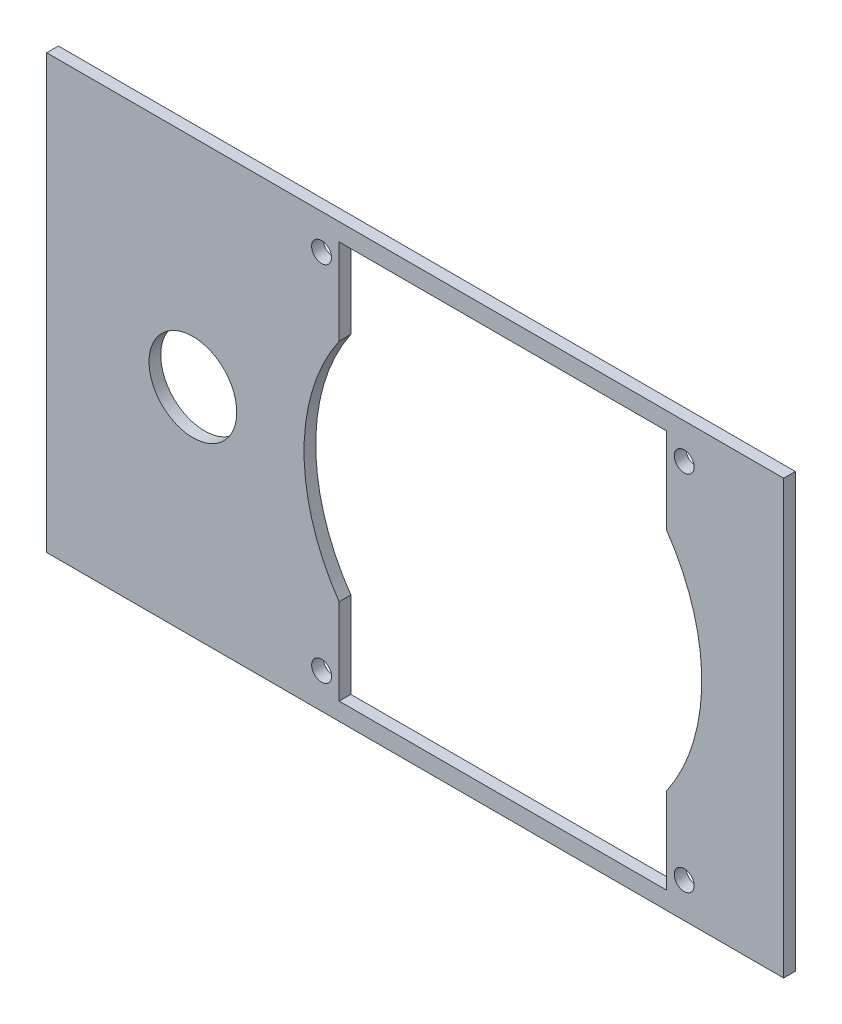
ISO-10303-21;
HEADER;
FILE_DESCRIPTION(('STEP AP214'),'2;1');
FILE_NAME('part.step','',(''),(''),'','','');
FILE_SCHEMA(('AUTOMOTIVE_DESIGN { 1 0 10303 214 1 1 1 1 }'));
ENDSEC;
DATA;
#1=APPLICATION_CONTEXT('core data for automotive mechanical design processes');
#2=APPLICATION_PROTOCOL_DEFINITION('international standard','automotive_design',2000,#1);
#3=PRODUCT_CONTEXT('',#1,'mechanical');
#4=PRODUCT('Part','Part','',(#3));
#5=PRODUCT_RELATED_PRODUCT_CATEGORY('part','',(#4));
#6=PRODUCT_DEFINITION_FORMATION('','',#4);
#7=PRODUCT_DEFINITION_CONTEXT('part definition',#1,'design');
#8=PRODUCT_DEFINITION('design','',#6,#7);
#9=PRODUCT_DEFINITION_SHAPE('','',#8);
#10=(LENGTH_UNIT() NAMED_UNIT(*) SI_UNIT(.MILLI.,.METRE.));
#11=(NAMED_UNIT(*) PLANE_ANGLE_UNIT() SI_UNIT($,.RADIAN.));
#12=(NAMED_UNIT(*) SI_UNIT($,.STERADIAN.) SOLID_ANGLE_UNIT());
#13=UNCERTAINTY_MEASURE_WITH_UNIT(LENGTH_MEASURE(1.E-05),#10,'distance_accuracy_value','');
#14=(GEOMETRIC_REPRESENTATION_CONTEXT(3) GLOBAL_UNCERTAINTY_ASSIGNED_CONTEXT((#13)) GLOBAL_UNIT_ASSIGNED_CONTEXT((#10,
#11,#12)) REPRESENTATION_CONTEXT('',''));
#15=CARTESIAN_POINT('',(0.,0.,0.));
#16=DIRECTION('',(0.,0.,1.));
#17=DIRECTION('',(1.,0.,0.));
#18=AXIS2_PLACEMENT_3D('',#15,#16,#17);
#19=CARTESIAN_POINT('',(0.,0.,2.));
#20=DIRECTION('',(0.,0.,-1.));
#21=DIRECTION('',(-1.,0.,0.));
#22=AXIS2_PLACEMENT_3D('',#19,#20,#21);
#23=PLANE('',#22);
#24=DIRECTION('',(0.,-1.,0.));
#25=VECTOR('',#24,1.);
#26=CARTESIAN_POINT('',(0.,-74.,2.));
#27=LINE('',#26,#25);
#28=CARTESIAN_POINT('',(0.,0.,2.));
#29=VERTEX_POINT('',#28);
#30=CARTESIAN_POINT('',(0.,-74.,2.));
#31=VERTEX_POINT('',#30);
#32=EDGE_CURVE('E190',#29,#31,#27,.T.);
#33=ORIENTED_EDGE('',*,*,#32,.T.);
#34=DIRECTION('',(1.,0.,0.));
#35=VECTOR('',#34,1.);
#36=CARTESIAN_POINT('',(126.,-74.,2.));
#37=LINE('',#36,#35);
#38=CARTESIAN_POINT('',(126.,-74.,2.));
#39=VERTEX_POINT('',#38);
#40=EDGE_CURVE('E193',#31,#39,#37,.T.);
#41=ORIENTED_EDGE('',*,*,#40,.T.);
#42=DIRECTION('',(0.,1.,0.));
#43=VECTOR('',#42,1.);
#44=CARTESIAN_POINT('',(126.,0.,2.));
#45=LINE('',#44,#43);
#46=CARTESIAN_POINT('',(126.,0.,2.));
#47=VERTEX_POINT('',#46);
#48=EDGE_CURVE('E196',#39,#47,#45,.T.);
#49=ORIENTED_EDGE('',*,*,#48,.T.);
#50=DIRECTION('',(-1.,0.,0.));
#51=VECTOR('',#50,1.);
#52=CARTESIAN_POINT('',(0.,0.,2.));
#53=LINE('',#52,#51);
#54=EDGE_CURVE('E198',#47,#29,#53,.T.);
#55=ORIENTED_EDGE('',*,*,#54,.T.);
#56=EDGE_LOOP('',(#33,#41,#49,#55));
#57=FACE_BOUND('',#56,.T.);
#58=DIRECTION('',(0.,-1.,0.));
#59=VECTOR('',#58,1.);
#60=CARTESIAN_POINT('',(50.,-56.287301521986,2.));
#61=LINE('',#60,#59);
#62=CARTESIAN_POINT('',(50.,-56.287301521986,2.));
#63=VERTEX_POINT('',#62);
#64=CARTESIAN_POINT('',(50.,-71.,2.));
#65=VERTEX_POINT('',#64);
#66=EDGE_CURVE('E122',#63,#65,#61,.T.);
#67=ORIENTED_EDGE('',*,*,#66,.F.);
#68=CARTESIAN_POINT('',(78.,-37.,2.));
#69=DIRECTION('',(0.,0.,1.));
#70=DIRECTION('',(1.,0.,0.));
#71=AXIS2_PLACEMENT_3D('',#68,#69,#70);
#72=CIRCLE('',#71,34.);
#73=CARTESIAN_POINT('',(50.,-17.7126984780141,2.));
#74=VERTEX_POINT('',#73);
#75=EDGE_CURVE('E157',#74,#63,#72,.T.);
#76=ORIENTED_EDGE('',*,*,#75,.F.);
#77=DIRECTION('',(0.,-1.,0.));
#78=VECTOR('',#77,1.);
#79=CARTESIAN_POINT('',(50.,-2.99999999999999,2.));
#80=LINE('',#79,#78);
#81=CARTESIAN_POINT('',(50.,-2.99999999999999,2.));
#82=VERTEX_POINT('',#81);
#83=EDGE_CURVE('E155',#82,#74,#80,.T.);
#84=ORIENTED_EDGE('',*,*,#83,.F.);
#85=DIRECTION('',(-1.,0.,0.));
#86=VECTOR('',#85,1.);
#87=CARTESIAN_POINT('',(50.,-2.99999999999999,2.));
#88=LINE('',#87,#86);
#89=CARTESIAN_POINT('',(106.,-2.99999999999999,2.));
#90=VERTEX_POINT('',#89);
#91=EDGE_CURVE('E153',#90,#82,#88,.T.);
#92=ORIENTED_EDGE('',*,*,#91,.F.);
#93=DIRECTION('',(0.,1.,0.));
#94=VECTOR('',#93,1.);
#95=CARTESIAN_POINT('',(106.,-2.99999999999999,2.));
#96=LINE('',#95,#94);
#97=CARTESIAN_POINT('',(106.,-17.712698478014,2.));
#98=VERTEX_POINT('',#97);
#99=EDGE_CURVE('E151',#98,#90,#96,.T.);
#100=ORIENTED_EDGE('',*,*,#99,.F.);
#101=CARTESIAN_POINT('',(78.,-37.,2.));
#102=DIRECTION('',(0.,0.,1.));
#103=DIRECTION('',(1.,0.,0.));
#104=AXIS2_PLACEMENT_3D('',#101,#102,#103);
#105=CIRCLE('',#104,34.);
#106=CARTESIAN_POINT('',(106.,-56.287301521986,2.));
#107=VERTEX_POINT('',#106);
#108=EDGE_CURVE('E146',#107,#98,#105,.T.);
#109=ORIENTED_EDGE('',*,*,#108,.F.);
#110=DIRECTION('',(0.,1.,0.));
#111=VECTOR('',#110,1.);
#112=CARTESIAN_POINT('',(106.,-56.287301521986,2.));
#113=LINE('',#112,#111);
#114=CARTESIAN_POINT('',(106.,-71.,2.));
#115=VERTEX_POINT('',#114);
#116=EDGE_CURVE('E144',#115,#107,#113,.T.);
#117=ORIENTED_EDGE('',*,*,#116,.F.);
#118=DIRECTION('',(1.,0.,0.));
#119=VECTOR('',#118,1.);
#120=CARTESIAN_POINT('',(50.,-71.,2.));
#121=LINE('',#120,#119);
#122=EDGE_CURVE('E130',#65,#115,#121,.T.);
#123=ORIENTED_EDGE('',*,*,#122,.F.);
#124=EDGE_LOOP('',(#67,#76,#84,#92,#100,#109,#117,#123));
#125=FACE_BOUND('',#124,.T.);
#126=CARTESIAN_POINT('',(47.,-6.00000000000002,2.));
#127=DIRECTION('',(0.,0.,1.));
#128=DIRECTION('',(1.,0.,0.));
#129=AXIS2_PLACEMENT_3D('',#126,#127,#128);
#130=CIRCLE('',#129,1.7);
#131=CARTESIAN_POINT('',(48.7,-6.00000000000002,2.));
#132=VERTEX_POINT('',#131);
#133=EDGE_CURVE('E160',#132,#132,#130,.T.);
#134=ORIENTED_EDGE('',*,*,#133,.F.);
#135=EDGE_LOOP('',(#134));
#136=FACE_BOUND('',#135,.T.);
#137=CARTESIAN_POINT('',(109.,-6.00000000000002,2.));
#138=DIRECTION('',(0.,0.,1.));
#139=DIRECTION('',(1.,0.,0.));
#140=AXIS2_PLACEMENT_3D('',#137,#138,#139);
#141=CIRCLE('',#140,1.70000000000001);
#142=CARTESIAN_POINT('',(110.7,-6.00000000000002,2.));
#143=VERTEX_POINT('',#142);
#144=EDGE_CURVE('E328',#143,#143,#141,.T.);
#145=ORIENTED_EDGE('',*,*,#144,.F.);
#146=EDGE_LOOP('',(#145));
#147=FACE_BOUND('',#146,.T.);
#148=CARTESIAN_POINT('',(47.,-68.,2.));
#149=DIRECTION('',(0.,0.,1.));
#150=DIRECTION('',(1.,0.,0.));
#151=AXIS2_PLACEMENT_3D('',#148,#149,#150);
#152=CIRCLE('',#151,1.7);
#153=CARTESIAN_POINT('',(48.7,-68.,2.));
#154=VERTEX_POINT('',#153);
#155=EDGE_CURVE('E322',#154,#154,#152,.T.);
#156=ORIENTED_EDGE('',*,*,#155,.F.);
#157=EDGE_LOOP('',(#156));
#158=FACE_BOUND('',#157,.T.);
#159=CARTESIAN_POINT('',(109.,-68.,2.));
#160=DIRECTION('',(0.,0.,1.));
#161=DIRECTION('',(1.,0.,0.));
#162=AXIS2_PLACEMENT_3D('',#159,#160,#161);
#163=CIRCLE('',#162,1.7);
#164=CARTESIAN_POINT('',(110.7,-68.,2.));
#165=VERTEX_POINT('',#164);
#166=EDGE_CURVE('E316',#165,#165,#163,.T.);
#167=ORIENTED_EDGE('',*,*,#166,.F.);
#168=EDGE_LOOP('',(#167));
#169=FACE_BOUND('',#168,.T.);
#170=CARTESIAN_POINT('',(25.,-37.,2.));
#171=DIRECTION('',(0.,0.,1.));
#172=DIRECTION('',(1.,0.,0.));
#173=AXIS2_PLACEMENT_3D('',#170,#171,#172);
#174=CIRCLE('',#173,7.5);
#175=CARTESIAN_POINT('',(32.5,-37.,2.));
#176=VERTEX_POINT('',#175);
#177=EDGE_CURVE('E307',#176,#176,#174,.T.);
#178=ORIENTED_EDGE('',*,*,#177,.F.);
#179=EDGE_LOOP('',(#178));
#180=FACE_BOUND('',#179,.T.);
#181=ADVANCED_FACE('F33',(#57,#125,#136,#147,#158,#169,#180),#23,.F.);
#182=CARTESIAN_POINT('',(0.,0.,0.));
#183=DIRECTION('',(0.,0.,-1.));
#184=DIRECTION('',(-1.,0.,0.));
#185=AXIS2_PLACEMENT_3D('',#182,#183,#184);
#186=PLANE('',#185);
#187=CARTESIAN_POINT('',(109.,-68.,0.));
#188=DIRECTION('',(0.,0.,1.));
#189=DIRECTION('',(1.,0.,0.));
#190=AXIS2_PLACEMENT_3D('',#187,#188,#189);
#191=CIRCLE('',#190,1.7);
#192=CARTESIAN_POINT('',(110.7,-68.,0.));
#193=VERTEX_POINT('',#192);
#194=EDGE_CURVE('E313',#193,#193,#191,.T.);
#195=ORIENTED_EDGE('',*,*,#194,.T.);
#196=EDGE_LOOP('',(#195));
#197=FACE_BOUND('',#196,.T.);
#198=CARTESIAN_POINT('',(109.,-6.00000000000002,0.));
#199=DIRECTION('',(0.,0.,1.));
#200=DIRECTION('',(1.,0.,0.));
#201=AXIS2_PLACEMENT_3D('',#198,#199,#200);
#202=CIRCLE('',#201,1.70000000000001);
#203=CARTESIAN_POINT('',(110.7,-6.00000000000002,0.));
#204=VERTEX_POINT('',#203);
#205=EDGE_CURVE('E325',#204,#204,#202,.T.);
#206=ORIENTED_EDGE('',*,*,#205,.T.);
#207=EDGE_LOOP('',(#206));
#208=FACE_BOUND('',#207,.T.);
#209=CARTESIAN_POINT('',(78.,-37.,0.));
#210=DIRECTION('',(0.,0.,1.));
#211=DIRECTION('',(1.,0.,0.));
#212=AXIS2_PLACEMENT_3D('',#209,#210,#211);
#213=CIRCLE('',#212,34.);
#214=CARTESIAN_POINT('',(50.,-17.7126984780141,0.));
#215=VERTEX_POINT('',#214);
#216=CARTESIAN_POINT('',(50.,-56.287301521986,0.));
#217=VERTEX_POINT('',#216);
#218=EDGE_CURVE('E131',#215,#217,#213,.T.);
#219=ORIENTED_EDGE('',*,*,#218,.T.);
#220=DIRECTION('',(0.,-1.,0.));
#221=VECTOR('',#220,1.);
#222=CARTESIAN_POINT('',(50.,-56.287301521986,0.));
#223=LINE('',#222,#221);
#224=CARTESIAN_POINT('',(50.,-71.,0.));
#225=VERTEX_POINT('',#224);
#226=EDGE_CURVE('E56',#217,#225,#223,.T.);
#227=ORIENTED_EDGE('',*,*,#226,.T.);
#228=DIRECTION('',(1.,0.,0.));
#229=VECTOR('',#228,1.);
#230=CARTESIAN_POINT('',(50.,-71.,0.));
#231=LINE('',#230,#229);
#232=CARTESIAN_POINT('',(106.,-71.,0.));
#233=VERTEX_POINT('',#232);
#234=EDGE_CURVE('E137',#225,#233,#231,.T.);
#235=ORIENTED_EDGE('',*,*,#234,.T.);
#236=DIRECTION('',(0.,1.,0.));
#237=VECTOR('',#236,1.);
#238=CARTESIAN_POINT('',(106.,-56.287301521986,0.));
#239=LINE('',#238,#237);
#240=CARTESIAN_POINT('',(106.,-56.287301521986,0.));
#241=VERTEX_POINT('',#240);
#242=EDGE_CURVE('E162',#233,#241,#239,.T.);
#243=ORIENTED_EDGE('',*,*,#242,.T.);
#244=CARTESIAN_POINT('',(78.,-37.,0.));
#245=DIRECTION('',(0.,0.,1.));
#246=DIRECTION('',(1.,0.,0.));
#247=AXIS2_PLACEMENT_3D('',#244,#245,#246);
#248=CIRCLE('',#247,34.);
#249=CARTESIAN_POINT('',(106.,-17.712698478014,0.));
#250=VERTEX_POINT('',#249);
#251=EDGE_CURVE('E165',#241,#250,#248,.T.);
#252=ORIENTED_EDGE('',*,*,#251,.T.);
#253=DIRECTION('',(0.,1.,0.));
#254=VECTOR('',#253,1.);
#255=CARTESIAN_POINT('',(106.,-2.99999999999999,0.));
#256=LINE('',#255,#254);
#257=CARTESIAN_POINT('',(106.,-2.99999999999999,0.));
#258=VERTEX_POINT('',#257);
#259=EDGE_CURVE('E168',#250,#258,#256,.T.);
#260=ORIENTED_EDGE('',*,*,#259,.T.);
#261=DIRECTION('',(-1.,0.,0.));
#262=VECTOR('',#261,1.);
#263=CARTESIAN_POINT('',(50.,-2.99999999999999,0.));
#264=LINE('',#263,#262);
#265=CARTESIAN_POINT('',(50.,-2.99999999999999,0.));
#266=VERTEX_POINT('',#265);
#267=EDGE_CURVE('E171',#258,#266,#264,.T.);
#268=ORIENTED_EDGE('',*,*,#267,.T.);
#269=DIRECTION('',(0.,-1.,0.));
#270=VECTOR('',#269,1.);
#271=CARTESIAN_POINT('',(50.,-2.99999999999999,0.));
#272=LINE('',#271,#270);
#273=EDGE_CURVE('E174',#266,#215,#272,.T.);
#274=ORIENTED_EDGE('',*,*,#273,.T.);
#275=EDGE_LOOP('',(#219,#227,#235,#243,#252,#260,#268,#274));
#276=FACE_BOUND('',#275,.T.);
#277=DIRECTION('',(0.,-1.,0.));
#278=VECTOR('',#277,1.);
#279=CARTESIAN_POINT('',(0.,-74.,0.));
#280=LINE('',#279,#278);
#281=CARTESIAN_POINT('',(0.,0.,0.));
#282=VERTEX_POINT('',#281);
#283=CARTESIAN_POINT('',(0.,-74.,0.));
#284=VERTEX_POINT('',#283);
#285=EDGE_CURVE('E138',#282,#284,#280,.T.);
#286=ORIENTED_EDGE('',*,*,#285,.F.);
#287=DIRECTION('',(-1.,0.,0.));
#288=VECTOR('',#287,1.);
#289=CARTESIAN_POINT('',(0.,0.,0.));
#290=LINE('',#289,#288);
#291=CARTESIAN_POINT('',(126.,0.,0.));
#292=VERTEX_POINT('',#291);
#293=EDGE_CURVE('E194',#292,#282,#290,.T.);
#294=ORIENTED_EDGE('',*,*,#293,.F.);
#295=DIRECTION('',(0.,1.,0.));
#296=VECTOR('',#295,1.);
#297=CARTESIAN_POINT('',(126.,0.,0.));
#298=LINE('',#297,#296);
#299=CARTESIAN_POINT('',(126.,-74.,0.));
#300=VERTEX_POINT('',#299);
#301=EDGE_CURVE('E205',#300,#292,#298,.T.);
#302=ORIENTED_EDGE('',*,*,#301,.F.);
#303=DIRECTION('',(1.,0.,0.));
#304=VECTOR('',#303,1.);
#305=CARTESIAN_POINT('',(126.,-74.,0.));
#306=LINE('',#305,#304);
#307=EDGE_CURVE('E203',#284,#300,#306,.T.);
#308=ORIENTED_EDGE('',*,*,#307,.F.);
#309=EDGE_LOOP('',(#286,#294,#302,#308));
#310=FACE_BOUND('',#309,.T.);
#311=CARTESIAN_POINT('',(47.,-6.00000000000002,0.));
#312=DIRECTION('',(0.,0.,1.));
#313=DIRECTION('',(1.,0.,0.));
#314=AXIS2_PLACEMENT_3D('',#311,#312,#313);
#315=CIRCLE('',#314,1.7);
#316=CARTESIAN_POINT('',(48.7,-6.00000000000002,0.));
#317=VERTEX_POINT('',#316);
#318=EDGE_CURVE('E331',#317,#317,#315,.T.);
#319=ORIENTED_EDGE('',*,*,#318,.T.);
#320=EDGE_LOOP('',(#319));
#321=FACE_BOUND('',#320,.T.);
#322=CARTESIAN_POINT('',(47.,-68.,0.));
#323=DIRECTION('',(0.,0.,1.));
#324=DIRECTION('',(1.,0.,0.));
#325=AXIS2_PLACEMENT_3D('',#322,#323,#324);
#326=CIRCLE('',#325,1.7);
#327=CARTESIAN_POINT('',(48.7,-68.,0.));
#328=VERTEX_POINT('',#327);
#329=EDGE_CURVE('E319',#328,#328,#326,.T.);
#330=ORIENTED_EDGE('',*,*,#329,.T.);
#331=EDGE_LOOP('',(#330));
#332=FACE_BOUND('',#331,.T.);
#333=CARTESIAN_POINT('',(25.,-37.,0.));
#334=DIRECTION('',(0.,0.,1.));
#335=DIRECTION('',(1.,0.,0.));
#336=AXIS2_PLACEMENT_3D('',#333,#334,#335);
#337=CIRCLE('',#336,7.5);
#338=CARTESIAN_POINT('',(32.5,-37.,0.));
#339=VERTEX_POINT('',#338);
#340=EDGE_CURVE('E310',#339,#339,#337,.T.);
#341=ORIENTED_EDGE('',*,*,#340,.T.);
#342=EDGE_LOOP('',(#341));
#343=FACE_BOUND('',#342,.T.);
#344=ADVANCED_FACE('F223',(#197,#208,#276,#310,#321,#332,#343),#186,.T.);
#345=CARTESIAN_POINT('',(0.,-74.,2.));
#346=DIRECTION('',(1.,0.,0.));
#347=DIRECTION('',(0.,0.,-1.));
#348=AXIS2_PLACEMENT_3D('',#345,#346,#347);
#349=PLANE('',#348);
#350=ORIENTED_EDGE('',*,*,#285,.T.);
#351=DIRECTION('',(0.,0.,-1.));
#352=VECTOR('',#351,1.);
#353=CARTESIAN_POINT('',(0.,-74.,2.));
#354=LINE('',#353,#352);
#355=EDGE_CURVE('E11',#31,#284,#354,.T.);
#356=ORIENTED_EDGE('',*,*,#355,.F.);
#357=ORIENTED_EDGE('',*,*,#32,.F.);
#358=DIRECTION('',(0.,0.,-1.));
#359=VECTOR('',#358,1.);
#360=CARTESIAN_POINT('',(0.,0.,2.));
#361=LINE('',#360,#359);
#362=EDGE_CURVE('E200',#29,#282,#361,.T.);
#363=ORIENTED_EDGE('',*,*,#362,.T.);
#364=EDGE_LOOP('',(#350,#356,#357,#363));
#365=FACE_BOUND('',#364,.T.);
#366=ADVANCED_FACE('F35',(#365),#349,.F.);
#367=CARTESIAN_POINT('',(126.,-74.,2.));
#368=DIRECTION('',(0.,1.,0.));
#369=DIRECTION('',(-1.,0.,0.));
#370=AXIS2_PLACEMENT_3D('',#367,#368,#369);
#371=PLANE('',#370);
#372=ORIENTED_EDGE('',*,*,#307,.T.);
#373=DIRECTION('',(0.,0.,-1.));
#374=VECTOR('',#373,1.);
#375=CARTESIAN_POINT('',(126.,-74.,2.));
#376=LINE('',#375,#374);
#377=EDGE_CURVE('E41',#39,#300,#376,.T.);
#378=ORIENTED_EDGE('',*,*,#377,.F.);
#379=ORIENTED_EDGE('',*,*,#40,.F.);
#380=ORIENTED_EDGE('',*,*,#355,.T.);
#381=EDGE_LOOP('',(#372,#378,#379,#380));
#382=FACE_BOUND('',#381,.T.);
#383=ADVANCED_FACE('F233',(#382),#371,.F.);
#384=CARTESIAN_POINT('',(126.,0.,2.));
#385=DIRECTION('',(-1.,0.,0.));
#386=DIRECTION('',(0.,-1.,0.));
#387=AXIS2_PLACEMENT_3D('',#384,#385,#386);
#388=PLANE('',#387);
#389=ORIENTED_EDGE('',*,*,#301,.T.);
#390=DIRECTION('',(0.,0.,-1.));
#391=VECTOR('',#390,1.);
#392=CARTESIAN_POINT('',(126.,0.,2.));
#393=LINE('',#392,#391);
#394=EDGE_CURVE('E210',#47,#292,#393,.T.);
#395=ORIENTED_EDGE('',*,*,#394,.F.);
#396=ORIENTED_EDGE('',*,*,#48,.F.);
#397=ORIENTED_EDGE('',*,*,#377,.T.);
#398=EDGE_LOOP('',(#389,#395,#396,#397));
#399=FACE_BOUND('',#398,.T.);
#400=ADVANCED_FACE('F217',(#399),#388,.F.);
#401=CARTESIAN_POINT('',(0.,0.,2.));
#402=DIRECTION('',(0.,-1.,0.));
#403=DIRECTION('',(1.,0.,0.));
#404=AXIS2_PLACEMENT_3D('',#401,#402,#403);
#405=PLANE('',#404);
#406=ORIENTED_EDGE('',*,*,#293,.T.);
#407=ORIENTED_EDGE('',*,*,#362,.F.);
#408=ORIENTED_EDGE('',*,*,#54,.F.);
#409=ORIENTED_EDGE('',*,*,#394,.T.);
#410=EDGE_LOOP('',(#406,#407,#408,#409));
#411=FACE_BOUND('',#410,.T.);
#412=ADVANCED_FACE('F227',(#411),#405,.F.);
#413=CARTESIAN_POINT('',(50.,-56.287301521986,2.));
#414=DIRECTION('',(1.,0.,0.));
#415=DIRECTION('',(0.,0.,-1.));
#416=AXIS2_PLACEMENT_3D('',#413,#414,#415);
#417=PLANE('',#416);
#418=ORIENTED_EDGE('',*,*,#226,.F.);
#419=DIRECTION('',(0.,0.,-1.));
#420=VECTOR('',#419,1.);
#421=CARTESIAN_POINT('',(50.,-56.287301521986,2.));
#422=LINE('',#421,#420);
#423=EDGE_CURVE('E126',#63,#217,#422,.T.);
#424=ORIENTED_EDGE('',*,*,#423,.F.);
#425=ORIENTED_EDGE('',*,*,#66,.T.);
#426=DIRECTION('',(0.,0.,-1.));
#427=VECTOR('',#426,1.);
#428=CARTESIAN_POINT('',(50.,-71.,2.));
#429=LINE('',#428,#427);
#430=EDGE_CURVE('E125',#65,#225,#429,.T.);
#431=ORIENTED_EDGE('',*,*,#430,.T.);
#432=EDGE_LOOP('',(#418,#424,#425,#431));
#433=FACE_BOUND('',#432,.T.);
#434=ADVANCED_FACE('F124',(#433),#417,.T.);
#435=CARTESIAN_POINT('',(50.,-71.,2.));
#436=DIRECTION('',(0.,1.,0.));
#437=DIRECTION('',(0.,0.,1.));
#438=AXIS2_PLACEMENT_3D('',#435,#436,#437);
#439=PLANE('',#438);
#440=ORIENTED_EDGE('',*,*,#234,.F.);
#441=ORIENTED_EDGE('',*,*,#430,.F.);
#442=ORIENTED_EDGE('',*,*,#122,.T.);
#443=DIRECTION('',(0.,0.,-1.));
#444=VECTOR('',#443,1.);
#445=CARTESIAN_POINT('',(106.,-71.,2.));
#446=LINE('',#445,#444);
#447=EDGE_CURVE('E139',#115,#233,#446,.T.);
#448=ORIENTED_EDGE('',*,*,#447,.T.);
#449=EDGE_LOOP('',(#440,#441,#442,#448));
#450=FACE_BOUND('',#449,.T.);
#451=ADVANCED_FACE('F134',(#450),#439,.T.);
#452=CARTESIAN_POINT('',(106.,-56.287301521986,2.));
#453=DIRECTION('',(-1.,0.,0.));
#454=DIRECTION('',(0.,0.,1.));
#455=AXIS2_PLACEMENT_3D('',#452,#453,#454);
#456=PLANE('',#455);
#457=ORIENTED_EDGE('',*,*,#242,.F.);
#458=ORIENTED_EDGE('',*,*,#447,.F.);
#459=ORIENTED_EDGE('',*,*,#116,.T.);
#460=DIRECTION('',(0.,0.,-1.));
#461=VECTOR('',#460,1.);
#462=CARTESIAN_POINT('',(106.,-56.287301521986,2.));
#463=LINE('',#462,#461);
#464=EDGE_CURVE('E187',#107,#241,#463,.T.);
#465=ORIENTED_EDGE('',*,*,#464,.T.);
#466=EDGE_LOOP('',(#457,#458,#459,#465));
#467=FACE_BOUND('',#466,.T.);
#468=ADVANCED_FACE('F257',(#467),#456,.T.);
#469=CARTESIAN_POINT('',(78.,-37.,2.));
#470=DIRECTION('',(0.,0.,-1.));
#471=DIRECTION('',(-1.,0.,0.));
#472=AXIS2_PLACEMENT_3D('',#469,#470,#471);
#473=CYLINDRICAL_SURFACE('',#472,34.);
#474=ORIENTED_EDGE('',*,*,#251,.F.);
#475=ORIENTED_EDGE('',*,*,#464,.F.);
#476=ORIENTED_EDGE('',*,*,#108,.T.);
#477=DIRECTION('',(0.,0.,-1.));
#478=VECTOR('',#477,1.);
#479=CARTESIAN_POINT('',(106.,-17.712698478014,2.));
#480=LINE('',#479,#478);
#481=EDGE_CURVE('E185',#98,#250,#480,.T.);
#482=ORIENTED_EDGE('',*,*,#481,.T.);
#483=EDGE_LOOP('',(#474,#475,#476,#482));
#484=FACE_BOUND('',#483,.T.);
#485=ADVANCED_FACE('F261',(#484),#473,.F.);
#486=CARTESIAN_POINT('',(106.,-2.99999999999999,2.));
#487=DIRECTION('',(-1.,0.,0.));
#488=DIRECTION('',(0.,-1.,0.));
#489=AXIS2_PLACEMENT_3D('',#486,#487,#488);
#490=PLANE('',#489);
#491=ORIENTED_EDGE('',*,*,#259,.F.);
#492=ORIENTED_EDGE('',*,*,#481,.F.);
#493=ORIENTED_EDGE('',*,*,#99,.T.);
#494=DIRECTION('',(0.,0.,-1.));
#495=VECTOR('',#494,1.);
#496=CARTESIAN_POINT('',(106.,-2.99999999999999,2.));
#497=LINE('',#496,#495);
#498=EDGE_CURVE('E183',#90,#258,#497,.T.);
#499=ORIENTED_EDGE('',*,*,#498,.T.);
#500=EDGE_LOOP('',(#491,#492,#493,#499));
#501=FACE_BOUND('',#500,.T.);
#502=ADVANCED_FACE('F267',(#501),#490,.T.);
#503=CARTESIAN_POINT('',(50.,-2.99999999999999,2.));
#504=DIRECTION('',(0.,-1.,0.));
#505=DIRECTION('',(1.,0.,0.));
#506=AXIS2_PLACEMENT_3D('',#503,#504,#505);
#507=PLANE('',#506);
#508=ORIENTED_EDGE('',*,*,#267,.F.);
#509=ORIENTED_EDGE('',*,*,#498,.F.);
#510=ORIENTED_EDGE('',*,*,#91,.T.);
#511=DIRECTION('',(0.,0.,-1.));
#512=VECTOR('',#511,1.);
#513=CARTESIAN_POINT('',(50.,-2.99999999999999,2.));
#514=LINE('',#513,#512);
#515=EDGE_CURVE('E181',#82,#266,#514,.T.);
#516=ORIENTED_EDGE('',*,*,#515,.T.);
#517=EDGE_LOOP('',(#508,#509,#510,#516));
#518=FACE_BOUND('',#517,.T.);
#519=ADVANCED_FACE('F271',(#518),#507,.T.);
#520=CARTESIAN_POINT('',(50.,-2.99999999999999,2.));
#521=DIRECTION('',(1.,0.,0.));
#522=DIRECTION('',(0.,0.,-1.));
#523=AXIS2_PLACEMENT_3D('',#520,#521,#522);
#524=PLANE('',#523);
#525=ORIENTED_EDGE('',*,*,#273,.F.);
#526=ORIENTED_EDGE('',*,*,#515,.F.);
#527=ORIENTED_EDGE('',*,*,#83,.T.);
#528=DIRECTION('',(0.,0.,-1.));
#529=VECTOR('',#528,1.);
#530=CARTESIAN_POINT('',(50.,-17.7126984780141,2.));
#531=LINE('',#530,#529);
#532=EDGE_CURVE('E48',#74,#215,#531,.T.);
#533=ORIENTED_EDGE('',*,*,#532,.T.);
#534=EDGE_LOOP('',(#525,#526,#527,#533));
#535=FACE_BOUND('',#534,.T.);
#536=ADVANCED_FACE('F275',(#535),#524,.T.);
#537=CARTESIAN_POINT('',(78.,-37.,2.));
#538=DIRECTION('',(0.,0.,-1.));
#539=DIRECTION('',(-1.,0.,0.));
#540=AXIS2_PLACEMENT_3D('',#537,#538,#539);
#541=CYLINDRICAL_SURFACE('',#540,34.);
#542=ORIENTED_EDGE('',*,*,#218,.F.);
#543=ORIENTED_EDGE('',*,*,#532,.F.);
#544=ORIENTED_EDGE('',*,*,#75,.T.);
#545=ORIENTED_EDGE('',*,*,#423,.T.);
#546=EDGE_LOOP('',(#542,#543,#544,#545));
#547=FACE_BOUND('',#546,.T.);
#548=ADVANCED_FACE('F279',(#547),#541,.F.);
#549=CARTESIAN_POINT('',(47.,-6.00000000000002,2.));
#550=DIRECTION('',(0.,0.,-1.));
#551=DIRECTION('',(-1.,0.,0.));
#552=AXIS2_PLACEMENT_3D('',#549,#550,#551);
#553=CYLINDRICAL_SURFACE('',#552,1.7);
#554=ORIENTED_EDGE('',*,*,#133,.T.);
#555=EDGE_LOOP('',(#554));
#556=FACE_BOUND('',#555,.T.);
#557=ORIENTED_EDGE('',*,*,#318,.F.);
#558=EDGE_LOOP('',(#557));
#559=FACE_BOUND('',#558,.T.);
#560=ADVANCED_FACE('F283',(#556,#559),#553,.F.);
#561=CARTESIAN_POINT('',(109.,-6.00000000000002,2.));
#562=DIRECTION('',(0.,0.,-1.));
#563=DIRECTION('',(-1.,0.,0.));
#564=AXIS2_PLACEMENT_3D('',#561,#562,#563);
#565=CYLINDRICAL_SURFACE('',#564,1.70000000000001);
#566=ORIENTED_EDGE('',*,*,#144,.T.);
#567=EDGE_LOOP('',(#566));
#568=FACE_BOUND('',#567,.T.);
#569=ORIENTED_EDGE('',*,*,#205,.F.);
#570=EDGE_LOOP('',(#569));
#571=FACE_BOUND('',#570,.T.);
#572=ADVANCED_FACE('F286',(#568,#571),#565,.F.);
#573=CARTESIAN_POINT('',(47.,-68.,2.));
#574=DIRECTION('',(0.,0.,-1.));
#575=DIRECTION('',(-1.,0.,0.));
#576=AXIS2_PLACEMENT_3D('',#573,#574,#575);
#577=CYLINDRICAL_SURFACE('',#576,1.7);
#578=ORIENTED_EDGE('',*,*,#155,.T.);
#579=EDGE_LOOP('',(#578));
#580=FACE_BOUND('',#579,.T.);
#581=ORIENTED_EDGE('',*,*,#329,.F.);
#582=EDGE_LOOP('',(#581));
#583=FACE_BOUND('',#582,.T.);
#584=ADVANCED_FACE('F290',(#580,#583),#577,.F.);
#585=CARTESIAN_POINT('',(109.,-68.,2.));
#586=DIRECTION('',(0.,0.,-1.));
#587=DIRECTION('',(-1.,0.,0.));
#588=AXIS2_PLACEMENT_3D('',#585,#586,#587);
#589=CYLINDRICAL_SURFACE('',#588,1.7);
#590=ORIENTED_EDGE('',*,*,#166,.T.);
#591=EDGE_LOOP('',(#590));
#592=FACE_BOUND('',#591,.T.);
#593=ORIENTED_EDGE('',*,*,#194,.F.);
#594=EDGE_LOOP('',(#593));
#595=FACE_BOUND('',#594,.T.);
#596=ADVANCED_FACE('F294',(#592,#595),#589,.F.);
#597=CARTESIAN_POINT('',(25.,-37.,2.));
#598=DIRECTION('',(0.,0.,-1.));
#599=DIRECTION('',(-1.,0.,0.));
#600=AXIS2_PLACEMENT_3D('',#597,#598,#599);
#601=CYLINDRICAL_SURFACE('',#600,7.5);
#602=ORIENTED_EDGE('',*,*,#177,.T.);
#603=EDGE_LOOP('',(#602));
#604=FACE_BOUND('',#603,.T.);
#605=ORIENTED_EDGE('',*,*,#340,.F.);
#606=EDGE_LOOP('',(#605));
#607=FACE_BOUND('',#606,.T.);
#608=ADVANCED_FACE('F298',(#604,#607),#601,.F.);
#609=CLOSED_SHELL('',(#181,#344,#366,#383,#400,#412,#434,#451,#468,#485,#502,#519,#536,#548,
#560,#572,#584,#596,#608));
#610=MANIFOLD_SOLID_BREP('B2',#609);
#611=ADVANCED_BREP_SHAPE_REPRESENTATION('',(#18,#610),#14);
#612=SHAPE_DEFINITION_REPRESENTATION(#9,#611);
ENDSEC;
END-ISO-10303-21;
